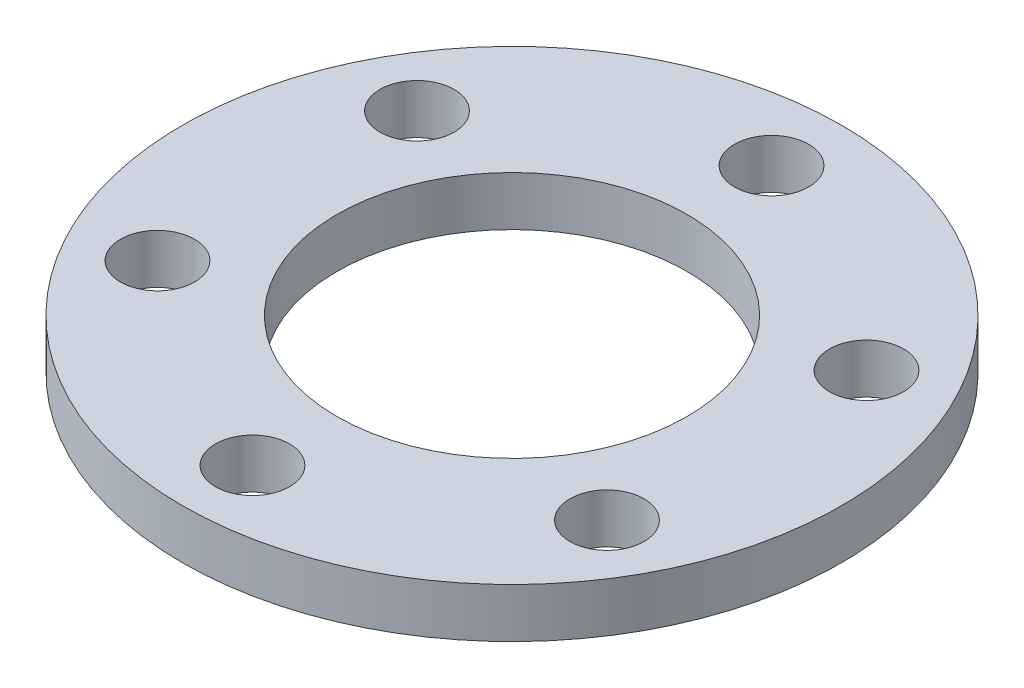
ISO-10303-21;
HEADER;
FILE_DESCRIPTION(('STEP AP214'),'2;1');
FILE_NAME('part.step','',(''),(''),'','','');
FILE_SCHEMA(('AUTOMOTIVE_DESIGN { 1 0 10303 214 1 1 1 1 }'));
ENDSEC;
DATA;
#1=APPLICATION_CONTEXT('core data for automotive mechanical design processes');
#2=APPLICATION_PROTOCOL_DEFINITION('international standard','automotive_design',2000,#1);
#3=PRODUCT_CONTEXT('',#1,'mechanical');
#4=PRODUCT('Part','Part','',(#3));
#5=PRODUCT_RELATED_PRODUCT_CATEGORY('part','',(#4));
#6=PRODUCT_DEFINITION_FORMATION('','',#4);
#7=PRODUCT_DEFINITION_CONTEXT('part definition',#1,'design');
#8=PRODUCT_DEFINITION('design','',#6,#7);
#9=PRODUCT_DEFINITION_SHAPE('','',#8);
#10=(LENGTH_UNIT() NAMED_UNIT(*) SI_UNIT(.MILLI.,.METRE.));
#11=(NAMED_UNIT(*) PLANE_ANGLE_UNIT() SI_UNIT($,.RADIAN.));
#12=(NAMED_UNIT(*) SI_UNIT($,.STERADIAN.) SOLID_ANGLE_UNIT());
#13=UNCERTAINTY_MEASURE_WITH_UNIT(LENGTH_MEASURE(1.E-05),#10,'distance_accuracy_value','');
#14=(GEOMETRIC_REPRESENTATION_CONTEXT(3) GLOBAL_UNCERTAINTY_ASSIGNED_CONTEXT((#13)) GLOBAL_UNIT_ASSIGNED_CONTEXT((#10,
#11,#12)) REPRESENTATION_CONTEXT('',''));
#15=CARTESIAN_POINT('',(0.,0.,0.));
#16=DIRECTION('',(0.,0.,1.));
#17=DIRECTION('',(1.,0.,0.));
#18=AXIS2_PLACEMENT_3D('',#15,#16,#17);
#19=CARTESIAN_POINT('',(0.,6.,0.));
#20=DIRECTION('',(0.,1.,0.));
#21=DIRECTION('',(0.,0.,1.));
#22=AXIS2_PLACEMENT_3D('',#19,#20,#21);
#23=PLANE('',#22);
#24=CARTESIAN_POINT('',(-27.2798002192078,6.,15.7500000000012));
#25=DIRECTION('',(0.,1.,0.));
#26=DIRECTION('',(0.,0.,1.));
#27=AXIS2_PLACEMENT_3D('',#24,#25,#26);
#28=CIRCLE('',#27,4.50000000000254);
#29=CARTESIAN_POINT('',(-27.2798002192078,6.,20.2500000000037));
#30=VERTEX_POINT('',#29);
#31=EDGE_CURVE('E88',#30,#30,#28,.T.);
#32=ORIENTED_EDGE('',*,*,#31,.F.);
#33=EDGE_LOOP('',(#32));
#34=FACE_BOUND('',#33,.T.);
#35=CARTESIAN_POINT('',(27.2798002192118,6.,15.7499999999988));
#36=DIRECTION('',(0.,1.,0.));
#37=DIRECTION('',(0.,0.,1.));
#38=AXIS2_PLACEMENT_3D('',#35,#36,#37);
#39=CIRCLE('',#38,4.50000000000172);
#40=CARTESIAN_POINT('',(27.2798002192118,6.,20.2500000000006));
#41=VERTEX_POINT('',#40);
#42=EDGE_CURVE('E72',#41,#41,#39,.T.);
#43=ORIENTED_EDGE('',*,*,#42,.F.);
#44=EDGE_LOOP('',(#43));
#45=FACE_BOUND('',#44,.T.);
#46=CARTESIAN_POINT('',(0.,6.,-31.5));
#47=DIRECTION('',(0.,1.,0.));
#48=DIRECTION('',(0.,0.,1.));
#49=AXIS2_PLACEMENT_3D('',#46,#47,#48);
#50=CIRCLE('',#49,4.5);
#51=CARTESIAN_POINT('',(0.,6.,-27.));
#52=VERTEX_POINT('',#51);
#53=EDGE_CURVE('E56',#52,#52,#50,.T.);
#54=ORIENTED_EDGE('',*,*,#53,.F.);
#55=EDGE_LOOP('',(#54));
#56=FACE_BOUND('',#55,.T.);
#57=CARTESIAN_POINT('',(0.,6.,0.));
#58=DIRECTION('',(0.,1.,0.));
#59=DIRECTION('',(0.,0.,1.));
#60=AXIS2_PLACEMENT_3D('',#57,#58,#59);
#61=CIRCLE('',#60,40.);
#62=CARTESIAN_POINT('',(0.,6.,40.));
#63=VERTEX_POINT('',#62);
#64=EDGE_CURVE('E10',#63,#63,#61,.T.);
#65=ORIENTED_EDGE('',*,*,#64,.T.);
#66=EDGE_LOOP('',(#65));
#67=FACE_BOUND('',#66,.T.);
#68=CARTESIAN_POINT('',(0.,6.,0.));
#69=DIRECTION('',(0.,1.,0.));
#70=DIRECTION('',(0.,0.,1.));
#71=AXIS2_PLACEMENT_3D('',#68,#69,#70);
#72=CIRCLE('',#71,21.25);
#73=CARTESIAN_POINT('',(0.,6.,21.25));
#74=VERTEX_POINT('',#73);
#75=EDGE_CURVE('E50',#74,#74,#72,.T.);
#76=ORIENTED_EDGE('',*,*,#75,.F.);
#77=EDGE_LOOP('',(#76));
#78=FACE_BOUND('',#77,.T.);
#79=CARTESIAN_POINT('',(27.2798002192105,6.,-15.7500000000012));
#80=DIRECTION('',(0.,1.,0.));
#81=DIRECTION('',(0.,0.,1.));
#82=AXIS2_PLACEMENT_3D('',#79,#80,#81);
#83=CIRCLE('',#82,4.50000000000038);
#84=CARTESIAN_POINT('',(27.2798002192105,6.,-11.2500000000008));
#85=VERTEX_POINT('',#84);
#86=EDGE_CURVE('E64',#85,#85,#83,.T.);
#87=ORIENTED_EDGE('',*,*,#86,.F.);
#88=EDGE_LOOP('',(#87));
#89=FACE_BOUND('',#88,.T.);
#90=CARTESIAN_POINT('',(2.67427862892124E-12,6.,31.5));
#91=DIRECTION('',(0.,1.,0.));
#92=DIRECTION('',(0.,0.,1.));
#93=AXIS2_PLACEMENT_3D('',#90,#91,#92);
#94=CIRCLE('',#93,4.50000000000277);
#95=CARTESIAN_POINT('',(2.67427862892124E-12,6.,36.0000000000028));
#96=VERTEX_POINT('',#95);
#97=EDGE_CURVE('E80',#96,#96,#94,.T.);
#98=ORIENTED_EDGE('',*,*,#97,.F.);
#99=EDGE_LOOP('',(#98));
#100=FACE_BOUND('',#99,.T.);
#101=CARTESIAN_POINT('',(-27.2798002192092,6.,-15.7499999999988));
#102=DIRECTION('',(0.,1.,0.));
#103=DIRECTION('',(0.,0.,1.));
#104=AXIS2_PLACEMENT_3D('',#101,#102,#103);
#105=CIRCLE('',#104,4.50000000000135);
#106=CARTESIAN_POINT('',(-27.2798002192092,6.,-11.2499999999975));
#107=VERTEX_POINT('',#106);
#108=EDGE_CURVE('E96',#107,#107,#105,.T.);
#109=ORIENTED_EDGE('',*,*,#108,.F.);
#110=EDGE_LOOP('',(#109));
#111=FACE_BOUND('',#110,.T.);
#112=ADVANCED_FACE('F37',(#34,#45,#56,#67,#78,#89,#100,#111),#23,.T.);
#113=CARTESIAN_POINT('',(0.,0.,0.));
#114=DIRECTION('',(0.,1.,0.));
#115=DIRECTION('',(0.,0.,1.));
#116=AXIS2_PLACEMENT_3D('',#113,#114,#115);
#117=PLANE('',#116);
#118=CARTESIAN_POINT('',(0.,0.,0.));
#119=DIRECTION('',(0.,1.,0.));
#120=DIRECTION('',(0.,0.,1.));
#121=AXIS2_PLACEMENT_3D('',#118,#119,#120);
#122=CIRCLE('',#121,40.);
#123=CARTESIAN_POINT('',(0.,0.,40.));
#124=VERTEX_POINT('',#123);
#125=EDGE_CURVE('E41',#124,#124,#122,.T.);
#126=ORIENTED_EDGE('',*,*,#125,.F.);
#127=EDGE_LOOP('',(#126));
#128=FACE_BOUND('',#127,.T.);
#129=CARTESIAN_POINT('',(0.,0.,0.));
#130=DIRECTION('',(0.,1.,0.));
#131=DIRECTION('',(0.,0.,1.));
#132=AXIS2_PLACEMENT_3D('',#129,#130,#131);
#133=CIRCLE('',#132,21.25);
#134=CARTESIAN_POINT('',(0.,0.,21.25));
#135=VERTEX_POINT('',#134);
#136=EDGE_CURVE('E52',#135,#135,#133,.T.);
#137=ORIENTED_EDGE('',*,*,#136,.T.);
#138=EDGE_LOOP('',(#137));
#139=FACE_BOUND('',#138,.T.);
#140=CARTESIAN_POINT('',(0.,0.,-31.5));
#141=DIRECTION('',(0.,1.,0.));
#142=DIRECTION('',(0.,0.,1.));
#143=AXIS2_PLACEMENT_3D('',#140,#141,#142);
#144=CIRCLE('',#143,4.5);
#145=CARTESIAN_POINT('',(0.,0.,-27.));
#146=VERTEX_POINT('',#145);
#147=EDGE_CURVE('E60',#146,#146,#144,.T.);
#148=ORIENTED_EDGE('',*,*,#147,.T.);
#149=EDGE_LOOP('',(#148));
#150=FACE_BOUND('',#149,.T.);
#151=CARTESIAN_POINT('',(27.2798002192105,0.,-15.7500000000012));
#152=DIRECTION('',(0.,1.,0.));
#153=DIRECTION('',(0.,0.,1.));
#154=AXIS2_PLACEMENT_3D('',#151,#152,#153);
#155=CIRCLE('',#154,4.50000000000038);
#156=CARTESIAN_POINT('',(27.2798002192105,0.,-11.2500000000008));
#157=VERTEX_POINT('',#156);
#158=EDGE_CURVE('E68',#157,#157,#155,.T.);
#159=ORIENTED_EDGE('',*,*,#158,.T.);
#160=EDGE_LOOP('',(#159));
#161=FACE_BOUND('',#160,.T.);
#162=CARTESIAN_POINT('',(27.2798002192118,0.,15.7499999999988));
#163=DIRECTION('',(0.,1.,0.));
#164=DIRECTION('',(0.,0.,1.));
#165=AXIS2_PLACEMENT_3D('',#162,#163,#164);
#166=CIRCLE('',#165,4.50000000000172);
#167=CARTESIAN_POINT('',(27.2798002192118,0.,20.2500000000006));
#168=VERTEX_POINT('',#167);
#169=EDGE_CURVE('E76',#168,#168,#166,.T.);
#170=ORIENTED_EDGE('',*,*,#169,.T.);
#171=EDGE_LOOP('',(#170));
#172=FACE_BOUND('',#171,.T.);
#173=CARTESIAN_POINT('',(2.67427862892124E-12,0.,31.5));
#174=DIRECTION('',(0.,1.,0.));
#175=DIRECTION('',(0.,0.,1.));
#176=AXIS2_PLACEMENT_3D('',#173,#174,#175);
#177=CIRCLE('',#176,4.50000000000277);
#178=CARTESIAN_POINT('',(2.67427862892124E-12,0.,36.0000000000028));
#179=VERTEX_POINT('',#178);
#180=EDGE_CURVE('E84',#179,#179,#177,.T.);
#181=ORIENTED_EDGE('',*,*,#180,.T.);
#182=EDGE_LOOP('',(#181));
#183=FACE_BOUND('',#182,.T.);
#184=CARTESIAN_POINT('',(-27.2798002192078,0.,15.7500000000012));
#185=DIRECTION('',(0.,1.,0.));
#186=DIRECTION('',(0.,0.,1.));
#187=AXIS2_PLACEMENT_3D('',#184,#185,#186);
#188=CIRCLE('',#187,4.50000000000254);
#189=CARTESIAN_POINT('',(-27.2798002192078,0.,20.2500000000037));
#190=VERTEX_POINT('',#189);
#191=EDGE_CURVE('E92',#190,#190,#188,.T.);
#192=ORIENTED_EDGE('',*,*,#191,.T.);
#193=EDGE_LOOP('',(#192));
#194=FACE_BOUND('',#193,.T.);
#195=CARTESIAN_POINT('',(-27.2798002192092,0.,-15.7499999999988));
#196=DIRECTION('',(0.,1.,0.));
#197=DIRECTION('',(0.,0.,1.));
#198=AXIS2_PLACEMENT_3D('',#195,#196,#197);
#199=CIRCLE('',#198,4.50000000000135);
#200=CARTESIAN_POINT('',(-27.2798002192092,0.,-11.2499999999975));
#201=VERTEX_POINT('',#200);
#202=EDGE_CURVE('E100',#201,#201,#199,.T.);
#203=ORIENTED_EDGE('',*,*,#202,.T.);
#204=EDGE_LOOP('',(#203));
#205=FACE_BOUND('',#204,.T.);
#206=ADVANCED_FACE('F112',(#128,#139,#150,#161,#172,#183,#194,#205),#117,.F.);
#207=CARTESIAN_POINT('',(0.,6.,0.));
#208=DIRECTION('',(0.,-1.,0.));
#209=DIRECTION('',(0.,0.,-1.));
#210=AXIS2_PLACEMENT_3D('',#207,#208,#209);
#211=CYLINDRICAL_SURFACE('',#210,40.);
#212=ORIENTED_EDGE('',*,*,#64,.F.);
#213=EDGE_LOOP('',(#212));
#214=FACE_BOUND('',#213,.T.);
#215=ORIENTED_EDGE('',*,*,#125,.T.);
#216=EDGE_LOOP('',(#215));
#217=FACE_BOUND('',#216,.T.);
#218=ADVANCED_FACE('F39',(#214,#217),#211,.T.);
#219=CARTESIAN_POINT('',(0.,6.,0.));
#220=DIRECTION('',(0.,-1.,0.));
#221=DIRECTION('',(0.,0.,-1.));
#222=AXIS2_PLACEMENT_3D('',#219,#220,#221);
#223=CYLINDRICAL_SURFACE('',#222,21.25);
#224=ORIENTED_EDGE('',*,*,#75,.T.);
#225=EDGE_LOOP('',(#224));
#226=FACE_BOUND('',#225,.T.);
#227=ORIENTED_EDGE('',*,*,#136,.F.);
#228=EDGE_LOOP('',(#227));
#229=FACE_BOUND('',#228,.T.);
#230=ADVANCED_FACE('F122',(#226,#229),#223,.F.);
#231=CARTESIAN_POINT('',(0.,6.,-31.5));
#232=DIRECTION('',(0.,-1.,0.));
#233=DIRECTION('',(0.,0.,-1.));
#234=AXIS2_PLACEMENT_3D('',#231,#232,#233);
#235=CYLINDRICAL_SURFACE('',#234,4.5);
#236=ORIENTED_EDGE('',*,*,#53,.T.);
#237=EDGE_LOOP('',(#236));
#238=FACE_BOUND('',#237,.T.);
#239=ORIENTED_EDGE('',*,*,#147,.F.);
#240=EDGE_LOOP('',(#239));
#241=FACE_BOUND('',#240,.T.);
#242=ADVANCED_FACE('F125',(#238,#241),#235,.F.);
#243=CARTESIAN_POINT('',(27.2798002192105,6.,-15.7500000000012));
#244=DIRECTION('',(0.,-1.,0.));
#245=DIRECTION('',(0.,0.,-1.));
#246=AXIS2_PLACEMENT_3D('',#243,#244,#245);
#247=CYLINDRICAL_SURFACE('',#246,4.50000000000038);
#248=ORIENTED_EDGE('',*,*,#86,.T.);
#249=EDGE_LOOP('',(#248));
#250=FACE_BOUND('',#249,.T.);
#251=ORIENTED_EDGE('',*,*,#158,.F.);
#252=EDGE_LOOP('',(#251));
#253=FACE_BOUND('',#252,.T.);
#254=ADVANCED_FACE('F129',(#250,#253),#247,.F.);
#255=CARTESIAN_POINT('',(27.2798002192118,6.,15.7499999999988));
#256=DIRECTION('',(0.,-1.,0.));
#257=DIRECTION('',(0.,0.,-1.));
#258=AXIS2_PLACEMENT_3D('',#255,#256,#257);
#259=CYLINDRICAL_SURFACE('',#258,4.50000000000172);
#260=ORIENTED_EDGE('',*,*,#42,.T.);
#261=EDGE_LOOP('',(#260));
#262=FACE_BOUND('',#261,.T.);
#263=ORIENTED_EDGE('',*,*,#169,.F.);
#264=EDGE_LOOP('',(#263));
#265=FACE_BOUND('',#264,.T.);
#266=ADVANCED_FACE('F133',(#262,#265),#259,.F.);
#267=CARTESIAN_POINT('',(2.67427862892124E-12,6.,31.5));
#268=DIRECTION('',(0.,-1.,0.));
#269=DIRECTION('',(0.,0.,-1.));
#270=AXIS2_PLACEMENT_3D('',#267,#268,#269);
#271=CYLINDRICAL_SURFACE('',#270,4.50000000000277);
#272=ORIENTED_EDGE('',*,*,#97,.T.);
#273=EDGE_LOOP('',(#272));
#274=FACE_BOUND('',#273,.T.);
#275=ORIENTED_EDGE('',*,*,#180,.F.);
#276=EDGE_LOOP('',(#275));
#277=FACE_BOUND('',#276,.T.);
#278=ADVANCED_FACE('F137',(#274,#277),#271,.F.);
#279=CARTESIAN_POINT('',(-27.2798002192078,6.,15.7500000000012));
#280=DIRECTION('',(0.,-1.,0.));
#281=DIRECTION('',(0.,0.,-1.));
#282=AXIS2_PLACEMENT_3D('',#279,#280,#281);
#283=CYLINDRICAL_SURFACE('',#282,4.50000000000254);
#284=ORIENTED_EDGE('',*,*,#31,.T.);
#285=EDGE_LOOP('',(#284));
#286=FACE_BOUND('',#285,.T.);
#287=ORIENTED_EDGE('',*,*,#191,.F.);
#288=EDGE_LOOP('',(#287));
#289=FACE_BOUND('',#288,.T.);
#290=ADVANCED_FACE('F141',(#286,#289),#283,.F.);
#291=CARTESIAN_POINT('',(-27.2798002192092,6.,-15.7499999999988));
#292=DIRECTION('',(0.,-1.,0.));
#293=DIRECTION('',(0.,0.,-1.));
#294=AXIS2_PLACEMENT_3D('',#291,#292,#293);
#295=CYLINDRICAL_SURFACE('',#294,4.50000000000135);
#296=ORIENTED_EDGE('',*,*,#108,.T.);
#297=EDGE_LOOP('',(#296));
#298=FACE_BOUND('',#297,.T.);
#299=ORIENTED_EDGE('',*,*,#202,.F.);
#300=EDGE_LOOP('',(#299));
#301=FACE_BOUND('',#300,.T.);
#302=ADVANCED_FACE('F108',(#298,#301),#295,.F.);
#303=CLOSED_SHELL('',(#112,#206,#218,#230,#242,#254,#266,#278,#290,#302));
#304=MANIFOLD_SOLID_BREP('B2',#303);
#305=ADVANCED_BREP_SHAPE_REPRESENTATION('',(#18,#304),#14);
#306=SHAPE_DEFINITION_REPRESENTATION(#9,#305);
ENDSEC;
END-ISO-10303-21;
